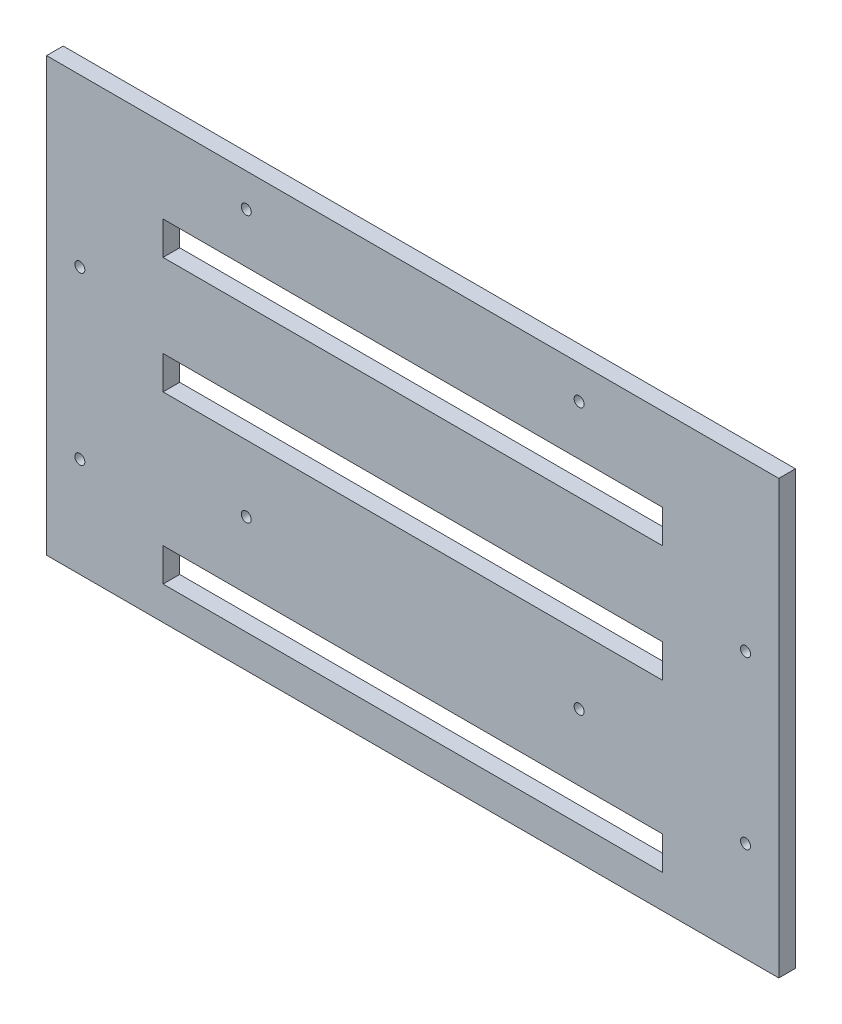
ISO-10303-21;
HEADER;
FILE_DESCRIPTION(('STEP AP214'),'2;1');
FILE_NAME('part.step','',(''),(''),'','','');
FILE_SCHEMA(('AUTOMOTIVE_DESIGN { 1 0 10303 214 1 1 1 1 }'));
ENDSEC;
DATA;
#1=APPLICATION_CONTEXT('core data for automotive mechanical design processes');
#2=APPLICATION_PROTOCOL_DEFINITION('international standard','automotive_design',2000,#1);
#3=PRODUCT_CONTEXT('',#1,'mechanical');
#4=PRODUCT('Part','Part','',(#3));
#5=PRODUCT_RELATED_PRODUCT_CATEGORY('part','',(#4));
#6=PRODUCT_DEFINITION_FORMATION('','',#4);
#7=PRODUCT_DEFINITION_CONTEXT('part definition',#1,'design');
#8=PRODUCT_DEFINITION('design','',#6,#7);
#9=PRODUCT_DEFINITION_SHAPE('','',#8);
#10=(LENGTH_UNIT() NAMED_UNIT(*) SI_UNIT(.MILLI.,.METRE.));
#11=(NAMED_UNIT(*) PLANE_ANGLE_UNIT() SI_UNIT($,.RADIAN.));
#12=(NAMED_UNIT(*) SI_UNIT($,.STERADIAN.) SOLID_ANGLE_UNIT());
#13=UNCERTAINTY_MEASURE_WITH_UNIT(LENGTH_MEASURE(1.E-05),#10,'distance_accuracy_value','');
#14=(GEOMETRIC_REPRESENTATION_CONTEXT(3) GLOBAL_UNCERTAINTY_ASSIGNED_CONTEXT((#13)) GLOBAL_UNIT_ASSIGNED_CONTEXT((#10,
#11,#12)) REPRESENTATION_CONTEXT('',''));
#15=CARTESIAN_POINT('',(0.,0.,0.));
#16=DIRECTION('',(0.,0.,1.));
#17=DIRECTION('',(1.,0.,0.));
#18=AXIS2_PLACEMENT_3D('',#15,#16,#17);
#19=CARTESIAN_POINT('',(110.,65.,5.));
#20=DIRECTION('',(-1.,0.,0.));
#21=DIRECTION('',(0.,-1.,0.));
#22=AXIS2_PLACEMENT_3D('',#19,#20,#21);
#23=PLANE('',#22);
#24=DIRECTION('',(0.,1.,0.));
#25=VECTOR('',#24,1.);
#26=CARTESIAN_POINT('',(110.,65.,0.));
#27=LINE('',#26,#25);
#28=CARTESIAN_POINT('',(110.,-65.,0.));
#29=VERTEX_POINT('',#28);
#30=CARTESIAN_POINT('',(110.,65.,0.));
#31=VERTEX_POINT('',#30);
#32=EDGE_CURVE('E264',#29,#31,#27,.T.);
#33=ORIENTED_EDGE('',*,*,#32,.T.);
#34=DIRECTION('',(0.,0.,-1.));
#35=VECTOR('',#34,1.);
#36=CARTESIAN_POINT('',(110.,65.,5.));
#37=LINE('',#36,#35);
#38=CARTESIAN_POINT('',(110.,65.,5.));
#39=VERTEX_POINT('',#38);
#40=EDGE_CURVE('E293',#39,#31,#37,.T.);
#41=ORIENTED_EDGE('',*,*,#40,.F.);
#42=DIRECTION('',(0.,1.,0.));
#43=VECTOR('',#42,1.);
#44=CARTESIAN_POINT('',(110.,65.,5.));
#45=LINE('',#44,#43);
#46=CARTESIAN_POINT('',(110.,-65.,5.));
#47=VERTEX_POINT('',#46);
#48=EDGE_CURVE('E267',#47,#39,#45,.T.);
#49=ORIENTED_EDGE('',*,*,#48,.F.);
#50=DIRECTION('',(0.,0.,-1.));
#51=VECTOR('',#50,1.);
#52=CARTESIAN_POINT('',(110.,-65.,5.));
#53=LINE('',#52,#51);
#54=EDGE_CURVE('E277',#47,#29,#53,.T.);
#55=ORIENTED_EDGE('',*,*,#54,.T.);
#56=EDGE_LOOP('',(#33,#41,#49,#55));
#57=FACE_BOUND('',#56,.T.);
#58=ADVANCED_FACE('F35',(#57),#23,.F.);
#59=CARTESIAN_POINT('',(-110.,65.,5.));
#60=DIRECTION('',(0.,-1.,0.));
#61=DIRECTION('',(0.,0.,-1.));
#62=AXIS2_PLACEMENT_3D('',#59,#60,#61);
#63=PLANE('',#62);
#64=DIRECTION('',(-1.,0.,0.));
#65=VECTOR('',#64,1.);
#66=CARTESIAN_POINT('',(-110.,65.,0.));
#67=LINE('',#66,#65);
#68=CARTESIAN_POINT('',(-110.,65.,0.));
#69=VERTEX_POINT('',#68);
#70=EDGE_CURVE('E280',#31,#69,#67,.T.);
#71=ORIENTED_EDGE('',*,*,#70,.T.);
#72=DIRECTION('',(0.,0.,-1.));
#73=VECTOR('',#72,1.);
#74=CARTESIAN_POINT('',(-110.,65.,5.));
#75=LINE('',#74,#73);
#76=CARTESIAN_POINT('',(-110.,65.,5.));
#77=VERTEX_POINT('',#76);
#78=EDGE_CURVE('E290',#77,#69,#75,.T.);
#79=ORIENTED_EDGE('',*,*,#78,.F.);
#80=DIRECTION('',(-1.,0.,0.));
#81=VECTOR('',#80,1.);
#82=CARTESIAN_POINT('',(-110.,65.,5.));
#83=LINE('',#82,#81);
#84=EDGE_CURVE('E270',#39,#77,#83,.T.);
#85=ORIENTED_EDGE('',*,*,#84,.F.);
#86=ORIENTED_EDGE('',*,*,#40,.T.);
#87=EDGE_LOOP('',(#71,#79,#85,#86));
#88=FACE_BOUND('',#87,.T.);
#89=ADVANCED_FACE('F344',(#88),#63,.F.);
#90=CARTESIAN_POINT('',(-110.,65.,5.));
#91=DIRECTION('',(1.,0.,0.));
#92=DIRECTION('',(0.,1.,0.));
#93=AXIS2_PLACEMENT_3D('',#90,#91,#92);
#94=PLANE('',#93);
#95=DIRECTION('',(0.,-1.,0.));
#96=VECTOR('',#95,1.);
#97=CARTESIAN_POINT('',(-110.,65.,0.));
#98=LINE('',#97,#96);
#99=CARTESIAN_POINT('',(-110.,-65.,0.));
#100=VERTEX_POINT('',#99);
#101=EDGE_CURVE('E282',#69,#100,#98,.T.);
#102=ORIENTED_EDGE('',*,*,#101,.T.);
#103=DIRECTION('',(0.,0.,-1.));
#104=VECTOR('',#103,1.);
#105=CARTESIAN_POINT('',(-110.,-65.,5.));
#106=LINE('',#105,#104);
#107=CARTESIAN_POINT('',(-110.,-65.,5.));
#108=VERTEX_POINT('',#107);
#109=EDGE_CURVE('E287',#108,#100,#106,.T.);
#110=ORIENTED_EDGE('',*,*,#109,.F.);
#111=DIRECTION('',(0.,-1.,0.));
#112=VECTOR('',#111,1.);
#113=CARTESIAN_POINT('',(-110.,65.,5.));
#114=LINE('',#113,#112);
#115=EDGE_CURVE('E273',#77,#108,#114,.T.);
#116=ORIENTED_EDGE('',*,*,#115,.F.);
#117=ORIENTED_EDGE('',*,*,#78,.T.);
#118=EDGE_LOOP('',(#102,#110,#116,#117));
#119=FACE_BOUND('',#118,.T.);
#120=ADVANCED_FACE('F349',(#119),#94,.F.);
#121=CARTESIAN_POINT('',(-110.,-65.,5.));
#122=DIRECTION('',(0.,1.,0.));
#123=DIRECTION('',(0.,0.,1.));
#124=AXIS2_PLACEMENT_3D('',#121,#122,#123);
#125=PLANE('',#124);
#126=DIRECTION('',(1.,0.,0.));
#127=VECTOR('',#126,1.);
#128=CARTESIAN_POINT('',(-110.,-65.,0.));
#129=LINE('',#128,#127);
#130=EDGE_CURVE('E271',#100,#29,#129,.T.);
#131=ORIENTED_EDGE('',*,*,#130,.T.);
#132=ORIENTED_EDGE('',*,*,#54,.F.);
#133=DIRECTION('',(1.,0.,0.));
#134=VECTOR('',#133,1.);
#135=CARTESIAN_POINT('',(-110.,-65.,5.));
#136=LINE('',#135,#134);
#137=EDGE_CURVE('E275',#108,#47,#136,.T.);
#138=ORIENTED_EDGE('',*,*,#137,.F.);
#139=ORIENTED_EDGE('',*,*,#109,.T.);
#140=EDGE_LOOP('',(#131,#132,#138,#139));
#141=FACE_BOUND('',#140,.T.);
#142=ADVANCED_FACE('F364',(#141),#125,.F.);
#143=CARTESIAN_POINT('',(0.,0.,5.));
#144=DIRECTION('',(0.,0.,1.));
#145=DIRECTION('',(1.,0.,0.));
#146=AXIS2_PLACEMENT_3D('',#143,#144,#145);
#147=PLANE('',#146);
#148=DIRECTION('',(0.,1.,0.));
#149=VECTOR('',#148,1.);
#150=CARTESIAN_POINT('',(75.,-45.,5.));
#151=LINE('',#150,#149);
#152=CARTESIAN_POINT('',(75.,-55.,5.));
#153=VERTEX_POINT('',#152);
#154=CARTESIAN_POINT('',(75.,-45.,5.));
#155=VERTEX_POINT('',#154);
#156=EDGE_CURVE('E49',#153,#155,#151,.T.);
#157=ORIENTED_EDGE('',*,*,#156,.F.);
#158=DIRECTION('',(1.,0.,0.));
#159=VECTOR('',#158,1.);
#160=CARTESIAN_POINT('',(-75.,-55.,5.));
#161=LINE('',#160,#159);
#162=CARTESIAN_POINT('',(-75.,-55.,5.));
#163=VERTEX_POINT('',#162);
#164=EDGE_CURVE('E171',#163,#153,#161,.T.);
#165=ORIENTED_EDGE('',*,*,#164,.F.);
#166=DIRECTION('',(0.,-1.,0.));
#167=VECTOR('',#166,1.);
#168=CARTESIAN_POINT('',(-75.,-45.,5.));
#169=LINE('',#168,#167);
#170=CARTESIAN_POINT('',(-75.,-45.,5.));
#171=VERTEX_POINT('',#170);
#172=EDGE_CURVE('E154',#171,#163,#169,.T.);
#173=ORIENTED_EDGE('',*,*,#172,.F.);
#174=DIRECTION('',(-1.,0.,0.));
#175=VECTOR('',#174,1.);
#176=CARTESIAN_POINT('',(-75.,-45.,5.));
#177=LINE('',#176,#175);
#178=EDGE_CURVE('E164',#155,#171,#177,.T.);
#179=ORIENTED_EDGE('',*,*,#178,.F.);
#180=EDGE_LOOP('',(#157,#165,#173,#179));
#181=FACE_BOUND('',#180,.T.);
#182=DIRECTION('',(0.,1.,0.));
#183=VECTOR('',#182,1.);
#184=CARTESIAN_POINT('',(75.0000000000001,40.,5.));
#185=LINE('',#184,#183);
#186=CARTESIAN_POINT('',(75.0000000000001,30.,5.));
#187=VERTEX_POINT('',#186);
#188=CARTESIAN_POINT('',(75.0000000000001,40.,5.));
#189=VERTEX_POINT('',#188);
#190=EDGE_CURVE('E57',#187,#189,#185,.T.);
#191=ORIENTED_EDGE('',*,*,#190,.F.);
#192=DIRECTION('',(1.,0.,0.));
#193=VECTOR('',#192,1.);
#194=CARTESIAN_POINT('',(-74.9999999999999,30.,5.));
#195=LINE('',#194,#193);
#196=CARTESIAN_POINT('',(-74.9999999999999,30.,5.));
#197=VERTEX_POINT('',#196);
#198=EDGE_CURVE('E188',#197,#187,#195,.T.);
#199=ORIENTED_EDGE('',*,*,#198,.F.);
#200=DIRECTION('',(0.,-1.,0.));
#201=VECTOR('',#200,1.);
#202=CARTESIAN_POINT('',(-74.9999999999999,40.,5.));
#203=LINE('',#202,#201);
#204=CARTESIAN_POINT('',(-74.9999999999999,40.,5.));
#205=VERTEX_POINT('',#204);
#206=EDGE_CURVE('E185',#205,#197,#203,.T.);
#207=ORIENTED_EDGE('',*,*,#206,.F.);
#208=DIRECTION('',(-1.,0.,0.));
#209=VECTOR('',#208,1.);
#210=CARTESIAN_POINT('',(-74.9999999999999,40.,5.));
#211=LINE('',#210,#209);
#212=EDGE_CURVE('E182',#189,#205,#211,.T.);
#213=ORIENTED_EDGE('',*,*,#212,.F.);
#214=EDGE_LOOP('',(#191,#199,#207,#213));
#215=FACE_BOUND('',#214,.T.);
#216=DIRECTION('',(0.,1.,0.));
#217=VECTOR('',#216,1.);
#218=CARTESIAN_POINT('',(75.,5.,5.));
#219=LINE('',#218,#217);
#220=CARTESIAN_POINT('',(75.,-5.,5.));
#221=VERTEX_POINT('',#220);
#222=CARTESIAN_POINT('',(75.,5.,5.));
#223=VERTEX_POINT('',#222);
#224=EDGE_CURVE('E178',#221,#223,#219,.T.);
#225=ORIENTED_EDGE('',*,*,#224,.F.);
#226=DIRECTION('',(1.,0.,0.));
#227=VECTOR('',#226,1.);
#228=CARTESIAN_POINT('',(-75.,-5.,5.));
#229=LINE('',#228,#227);
#230=CARTESIAN_POINT('',(-75.,-5.,5.));
#231=VERTEX_POINT('',#230);
#232=EDGE_CURVE('E206',#231,#221,#229,.T.);
#233=ORIENTED_EDGE('',*,*,#232,.F.);
#234=DIRECTION('',(0.,-1.,0.));
#235=VECTOR('',#234,1.);
#236=CARTESIAN_POINT('',(-75.,5.,5.));
#237=LINE('',#236,#235);
#238=CARTESIAN_POINT('',(-75.,5.,5.));
#239=VERTEX_POINT('',#238);
#240=EDGE_CURVE('E203',#239,#231,#237,.T.);
#241=ORIENTED_EDGE('',*,*,#240,.F.);
#242=DIRECTION('',(-1.,0.,0.));
#243=VECTOR('',#242,1.);
#244=CARTESIAN_POINT('',(-75.,5.,5.));
#245=LINE('',#244,#243);
#246=EDGE_CURVE('E200',#223,#239,#245,.T.);
#247=ORIENTED_EDGE('',*,*,#246,.F.);
#248=EDGE_LOOP('',(#225,#233,#241,#247));
#249=FACE_BOUND('',#248,.T.);
#250=CARTESIAN_POINT('',(100.,-35.,5.));
#251=DIRECTION('',(0.,0.,1.));
#252=DIRECTION('',(1.,0.,0.));
#253=AXIS2_PLACEMENT_3D('',#250,#251,#252);
#254=CIRCLE('',#253,1.5);
#255=CARTESIAN_POINT('',(101.5,-35.,5.));
#256=VERTEX_POINT('',#255);
#257=EDGE_CURVE('E223',#256,#256,#254,.T.);
#258=ORIENTED_EDGE('',*,*,#257,.F.);
#259=EDGE_LOOP('',(#258));
#260=FACE_BOUND('',#259,.T.);
#261=CARTESIAN_POINT('',(-100.,15.,5.));
#262=DIRECTION('',(0.,0.,1.));
#263=DIRECTION('',(1.,0.,0.));
#264=AXIS2_PLACEMENT_3D('',#261,#262,#263);
#265=CIRCLE('',#264,1.5);
#266=CARTESIAN_POINT('',(-98.5,15.,5.));
#267=VERTEX_POINT('',#266);
#268=EDGE_CURVE('E229',#267,#267,#265,.T.);
#269=ORIENTED_EDGE('',*,*,#268,.F.);
#270=EDGE_LOOP('',(#269));
#271=FACE_BOUND('',#270,.T.);
#272=CARTESIAN_POINT('',(-100.,-35.,5.));
#273=DIRECTION('',(0.,0.,1.));
#274=DIRECTION('',(1.,0.,0.));
#275=AXIS2_PLACEMENT_3D('',#272,#273,#274);
#276=CIRCLE('',#275,1.5);
#277=CARTESIAN_POINT('',(-98.5,-35.,5.));
#278=VERTEX_POINT('',#277);
#279=EDGE_CURVE('E212',#278,#278,#276,.T.);
#280=ORIENTED_EDGE('',*,*,#279,.F.);
#281=EDGE_LOOP('',(#280));
#282=FACE_BOUND('',#281,.T.);
#283=CARTESIAN_POINT('',(100.,15.,5.));
#284=DIRECTION('',(0.,0.,1.));
#285=DIRECTION('',(1.,0.,0.));
#286=AXIS2_PLACEMENT_3D('',#283,#284,#285);
#287=CIRCLE('',#286,1.5);
#288=CARTESIAN_POINT('',(101.5,15.,5.));
#289=VERTEX_POINT('',#288);
#290=EDGE_CURVE('E222',#289,#289,#287,.T.);
#291=ORIENTED_EDGE('',*,*,#290,.F.);
#292=EDGE_LOOP('',(#291));
#293=FACE_BOUND('',#292,.T.);
#294=CARTESIAN_POINT('',(50.,55.,5.));
#295=DIRECTION('',(0.,0.,1.));
#296=DIRECTION('',(1.,0.,0.));
#297=AXIS2_PLACEMENT_3D('',#294,#295,#296);
#298=CIRCLE('',#297,1.5);
#299=CARTESIAN_POINT('',(51.5,55.,5.));
#300=VERTEX_POINT('',#299);
#301=EDGE_CURVE('E247',#300,#300,#298,.T.);
#302=ORIENTED_EDGE('',*,*,#301,.F.);
#303=EDGE_LOOP('',(#302));
#304=FACE_BOUND('',#303,.T.);
#305=CARTESIAN_POINT('',(50.,-25.,5.));
#306=DIRECTION('',(0.,0.,1.));
#307=DIRECTION('',(1.,0.,0.));
#308=AXIS2_PLACEMENT_3D('',#305,#306,#307);
#309=CIRCLE('',#308,1.5);
#310=CARTESIAN_POINT('',(51.5,-25.,5.));
#311=VERTEX_POINT('',#310);
#312=EDGE_CURVE('E253',#311,#311,#309,.T.);
#313=ORIENTED_EDGE('',*,*,#312,.F.);
#314=EDGE_LOOP('',(#313));
#315=FACE_BOUND('',#314,.T.);
#316=CARTESIAN_POINT('',(-50.,-25.,5.));
#317=DIRECTION('',(0.,0.,1.));
#318=DIRECTION('',(1.,0.,0.));
#319=AXIS2_PLACEMENT_3D('',#316,#317,#318);
#320=CIRCLE('',#319,1.5);
#321=CARTESIAN_POINT('',(-48.5,-25.,5.));
#322=VERTEX_POINT('',#321);
#323=EDGE_CURVE('E240',#322,#322,#320,.T.);
#324=ORIENTED_EDGE('',*,*,#323,.F.);
#325=EDGE_LOOP('',(#324));
#326=FACE_BOUND('',#325,.T.);
#327=CARTESIAN_POINT('',(-50.,55.,5.));
#328=DIRECTION('',(0.,0.,1.));
#329=DIRECTION('',(1.,0.,0.));
#330=AXIS2_PLACEMENT_3D('',#327,#328,#329);
#331=CIRCLE('',#330,1.5);
#332=CARTESIAN_POINT('',(-48.5,55.,5.));
#333=VERTEX_POINT('',#332);
#334=EDGE_CURVE('E246',#333,#333,#331,.T.);
#335=ORIENTED_EDGE('',*,*,#334,.F.);
#336=EDGE_LOOP('',(#335));
#337=FACE_BOUND('',#336,.T.);
#338=ORIENTED_EDGE('',*,*,#48,.T.);
#339=ORIENTED_EDGE('',*,*,#84,.T.);
#340=ORIENTED_EDGE('',*,*,#115,.T.);
#341=ORIENTED_EDGE('',*,*,#137,.T.);
#342=EDGE_LOOP('',(#338,#339,#340,#341));
#343=FACE_BOUND('',#342,.T.);
#344=ADVANCED_FACE('F168',(#181,#215,#249,#260,#271,#282,#293,#304,#315,#326,#337,#343),#147,.T.);
#345=CARTESIAN_POINT('',(0.,0.,0.));
#346=DIRECTION('',(0.,0.,1.));
#347=DIRECTION('',(1.,0.,0.));
#348=AXIS2_PLACEMENT_3D('',#345,#346,#347);
#349=PLANE('',#348);
#350=DIRECTION('',(1.,0.,0.));
#351=VECTOR('',#350,1.);
#352=CARTESIAN_POINT('',(0.,-55.,0.));
#353=LINE('',#352,#351);
#354=CARTESIAN_POINT('',(-75.,-55.,0.));
#355=VERTEX_POINT('',#354);
#356=CARTESIAN_POINT('',(75.,-55.,0.));
#357=VERTEX_POINT('',#356);
#358=EDGE_CURVE('E42',#355,#357,#353,.T.);
#359=ORIENTED_EDGE('',*,*,#358,.T.);
#360=DIRECTION('',(0.,1.,0.));
#361=VECTOR('',#360,1.);
#362=CARTESIAN_POINT('',(75.,0.,0.));
#363=LINE('',#362,#361);
#364=CARTESIAN_POINT('',(75.,-45.,0.));
#365=VERTEX_POINT('',#364);
#366=EDGE_CURVE('E11',#357,#365,#363,.T.);
#367=ORIENTED_EDGE('',*,*,#366,.T.);
#368=DIRECTION('',(-1.,0.,0.));
#369=VECTOR('',#368,1.);
#370=CARTESIAN_POINT('',(0.,-45.,0.));
#371=LINE('',#370,#369);
#372=CARTESIAN_POINT('',(-75.,-45.,0.));
#373=VERTEX_POINT('',#372);
#374=EDGE_CURVE('E320',#365,#373,#371,.T.);
#375=ORIENTED_EDGE('',*,*,#374,.T.);
#376=DIRECTION('',(0.,-1.,0.));
#377=VECTOR('',#376,1.);
#378=CARTESIAN_POINT('',(-75.0000000000001,-1.04083408558609E-13,0.));
#379=LINE('',#378,#377);
#380=EDGE_CURVE('E157',#373,#355,#379,.T.);
#381=ORIENTED_EDGE('',*,*,#380,.T.);
#382=EDGE_LOOP('',(#359,#367,#375,#381));
#383=FACE_BOUND('',#382,.T.);
#384=DIRECTION('',(1.,0.,0.));
#385=VECTOR('',#384,1.);
#386=CARTESIAN_POINT('',(0.,30.,0.));
#387=LINE('',#386,#385);
#388=CARTESIAN_POINT('',(-74.9999999999999,30.,0.));
#389=VERTEX_POINT('',#388);
#390=CARTESIAN_POINT('',(75.0000000000001,30.,0.));
#391=VERTEX_POINT('',#390);
#392=EDGE_CURVE('E314',#389,#391,#387,.T.);
#393=ORIENTED_EDGE('',*,*,#392,.T.);
#394=DIRECTION('',(0.,1.,0.));
#395=VECTOR('',#394,1.);
#396=CARTESIAN_POINT('',(75.0000000000001,0.,0.));
#397=LINE('',#396,#395);
#398=CARTESIAN_POINT('',(75.0000000000001,40.,0.));
#399=VERTEX_POINT('',#398);
#400=EDGE_CURVE('E317',#391,#399,#397,.T.);
#401=ORIENTED_EDGE('',*,*,#400,.T.);
#402=DIRECTION('',(-1.,0.,0.));
#403=VECTOR('',#402,1.);
#404=CARTESIAN_POINT('',(0.,40.,0.));
#405=LINE('',#404,#403);
#406=CARTESIAN_POINT('',(-74.9999999999999,40.,0.));
#407=VERTEX_POINT('',#406);
#408=EDGE_CURVE('E308',#399,#407,#405,.T.);
#409=ORIENTED_EDGE('',*,*,#408,.T.);
#410=DIRECTION('',(0.,-1.,0.));
#411=VECTOR('',#410,1.);
#412=CARTESIAN_POINT('',(-74.9999999999999,0.,0.));
#413=LINE('',#412,#411);
#414=EDGE_CURVE('E311',#407,#389,#413,.T.);
#415=ORIENTED_EDGE('',*,*,#414,.T.);
#416=EDGE_LOOP('',(#393,#401,#409,#415));
#417=FACE_BOUND('',#416,.T.);
#418=DIRECTION('',(1.,0.,0.));
#419=VECTOR('',#418,1.);
#420=CARTESIAN_POINT('',(0.,-5.,0.));
#421=LINE('',#420,#419);
#422=CARTESIAN_POINT('',(-75.,-5.,0.));
#423=VERTEX_POINT('',#422);
#424=CARTESIAN_POINT('',(75.,-5.,0.));
#425=VERTEX_POINT('',#424);
#426=EDGE_CURVE('E302',#423,#425,#421,.T.);
#427=ORIENTED_EDGE('',*,*,#426,.T.);
#428=DIRECTION('',(0.,1.,0.));
#429=VECTOR('',#428,1.);
#430=CARTESIAN_POINT('',(75.,0.,0.));
#431=LINE('',#430,#429);
#432=CARTESIAN_POINT('',(75.,5.,0.));
#433=VERTEX_POINT('',#432);
#434=EDGE_CURVE('E305',#425,#433,#431,.T.);
#435=ORIENTED_EDGE('',*,*,#434,.T.);
#436=DIRECTION('',(-1.,0.,0.));
#437=VECTOR('',#436,1.);
#438=CARTESIAN_POINT('',(0.,5.,0.));
#439=LINE('',#438,#437);
#440=CARTESIAN_POINT('',(-75.,5.,0.));
#441=VERTEX_POINT('',#440);
#442=EDGE_CURVE('E296',#433,#441,#439,.T.);
#443=ORIENTED_EDGE('',*,*,#442,.T.);
#444=DIRECTION('',(0.,-1.,0.));
#445=VECTOR('',#444,1.);
#446=CARTESIAN_POINT('',(-75.,0.,0.));
#447=LINE('',#446,#445);
#448=EDGE_CURVE('E299',#441,#423,#447,.T.);
#449=ORIENTED_EDGE('',*,*,#448,.T.);
#450=EDGE_LOOP('',(#427,#435,#443,#449));
#451=FACE_BOUND('',#450,.T.);
#452=CARTESIAN_POINT('',(100.,-35.,0.));
#453=DIRECTION('',(0.,0.,1.));
#454=DIRECTION('',(1.,0.,0.));
#455=AXIS2_PLACEMENT_3D('',#452,#453,#454);
#456=CIRCLE('',#455,1.5);
#457=CARTESIAN_POINT('',(101.5,-35.,0.));
#458=VERTEX_POINT('',#457);
#459=EDGE_CURVE('E219',#458,#458,#456,.T.);
#460=ORIENTED_EDGE('',*,*,#459,.T.);
#461=EDGE_LOOP('',(#460));
#462=FACE_BOUND('',#461,.T.);
#463=CARTESIAN_POINT('',(-100.,15.,0.));
#464=DIRECTION('',(0.,0.,1.));
#465=DIRECTION('',(1.,0.,0.));
#466=AXIS2_PLACEMENT_3D('',#463,#464,#465);
#467=CIRCLE('',#466,1.5);
#468=CARTESIAN_POINT('',(-98.5,15.,0.));
#469=VERTEX_POINT('',#468);
#470=EDGE_CURVE('E226',#469,#469,#467,.T.);
#471=ORIENTED_EDGE('',*,*,#470,.T.);
#472=EDGE_LOOP('',(#471));
#473=FACE_BOUND('',#472,.T.);
#474=CARTESIAN_POINT('',(-100.,-35.,0.));
#475=DIRECTION('',(0.,0.,1.));
#476=DIRECTION('',(1.,0.,0.));
#477=AXIS2_PLACEMENT_3D('',#474,#475,#476);
#478=CIRCLE('',#477,1.5);
#479=CARTESIAN_POINT('',(-98.5,-35.,0.));
#480=VERTEX_POINT('',#479);
#481=EDGE_CURVE('E232',#480,#480,#478,.T.);
#482=ORIENTED_EDGE('',*,*,#481,.T.);
#483=EDGE_LOOP('',(#482));
#484=FACE_BOUND('',#483,.T.);
#485=CARTESIAN_POINT('',(100.,15.,0.));
#486=DIRECTION('',(0.,0.,1.));
#487=DIRECTION('',(1.,0.,0.));
#488=AXIS2_PLACEMENT_3D('',#485,#486,#487);
#489=CIRCLE('',#488,1.5);
#490=CARTESIAN_POINT('',(101.5,15.,0.));
#491=VERTEX_POINT('',#490);
#492=EDGE_CURVE('E237',#491,#491,#489,.T.);
#493=ORIENTED_EDGE('',*,*,#492,.T.);
#494=EDGE_LOOP('',(#493));
#495=FACE_BOUND('',#494,.T.);
#496=CARTESIAN_POINT('',(50.,55.,0.));
#497=DIRECTION('',(0.,0.,1.));
#498=DIRECTION('',(1.,0.,0.));
#499=AXIS2_PLACEMENT_3D('',#496,#497,#498);
#500=CIRCLE('',#499,1.5);
#501=CARTESIAN_POINT('',(51.5,55.,0.));
#502=VERTEX_POINT('',#501);
#503=EDGE_CURVE('E243',#502,#502,#500,.T.);
#504=ORIENTED_EDGE('',*,*,#503,.T.);
#505=EDGE_LOOP('',(#504));
#506=FACE_BOUND('',#505,.T.);
#507=CARTESIAN_POINT('',(50.,-25.,0.));
#508=DIRECTION('',(0.,0.,1.));
#509=DIRECTION('',(1.,0.,0.));
#510=AXIS2_PLACEMENT_3D('',#507,#508,#509);
#511=CIRCLE('',#510,1.5);
#512=CARTESIAN_POINT('',(51.5,-25.,0.));
#513=VERTEX_POINT('',#512);
#514=EDGE_CURVE('E250',#513,#513,#511,.T.);
#515=ORIENTED_EDGE('',*,*,#514,.T.);
#516=EDGE_LOOP('',(#515));
#517=FACE_BOUND('',#516,.T.);
#518=CARTESIAN_POINT('',(-50.,-25.,0.));
#519=DIRECTION('',(0.,0.,1.));
#520=DIRECTION('',(1.,0.,0.));
#521=AXIS2_PLACEMENT_3D('',#518,#519,#520);
#522=CIRCLE('',#521,1.5);
#523=CARTESIAN_POINT('',(-48.5,-25.,0.));
#524=VERTEX_POINT('',#523);
#525=EDGE_CURVE('E256',#524,#524,#522,.T.);
#526=ORIENTED_EDGE('',*,*,#525,.T.);
#527=EDGE_LOOP('',(#526));
#528=FACE_BOUND('',#527,.T.);
#529=CARTESIAN_POINT('',(-50.,55.,0.));
#530=DIRECTION('',(0.,0.,1.));
#531=DIRECTION('',(1.,0.,0.));
#532=AXIS2_PLACEMENT_3D('',#529,#530,#531);
#533=CIRCLE('',#532,1.5);
#534=CARTESIAN_POINT('',(-48.5,55.,0.));
#535=VERTEX_POINT('',#534);
#536=EDGE_CURVE('E261',#535,#535,#533,.T.);
#537=ORIENTED_EDGE('',*,*,#536,.T.);
#538=EDGE_LOOP('',(#537));
#539=FACE_BOUND('',#538,.T.);
#540=ORIENTED_EDGE('',*,*,#32,.F.);
#541=ORIENTED_EDGE('',*,*,#130,.F.);
#542=ORIENTED_EDGE('',*,*,#101,.F.);
#543=ORIENTED_EDGE('',*,*,#70,.F.);
#544=EDGE_LOOP('',(#540,#541,#542,#543));
#545=FACE_BOUND('',#544,.T.);
#546=ADVANCED_FACE('F324',(#383,#417,#451,#462,#473,#484,#495,#506,#517,#528,#539,#545),#349,.F.);
#547=CARTESIAN_POINT('',(-50.,55.,0.));
#548=DIRECTION('',(0.,0.,1.));
#549=DIRECTION('',(1.,0.,0.));
#550=AXIS2_PLACEMENT_3D('',#547,#548,#549);
#551=CYLINDRICAL_SURFACE('',#550,1.5);
#552=ORIENTED_EDGE('',*,*,#536,.F.);
#553=EDGE_LOOP('',(#552));
#554=FACE_BOUND('',#553,.T.);
#555=ORIENTED_EDGE('',*,*,#334,.T.);
#556=EDGE_LOOP('',(#555));
#557=FACE_BOUND('',#556,.T.);
#558=ADVANCED_FACE('F375',(#554,#557),#551,.F.);
#559=CARTESIAN_POINT('',(-50.,-25.,0.));
#560=DIRECTION('',(0.,0.,1.));
#561=DIRECTION('',(1.,0.,0.));
#562=AXIS2_PLACEMENT_3D('',#559,#560,#561);
#563=CYLINDRICAL_SURFACE('',#562,1.5);
#564=ORIENTED_EDGE('',*,*,#525,.F.);
#565=EDGE_LOOP('',(#564));
#566=FACE_BOUND('',#565,.T.);
#567=ORIENTED_EDGE('',*,*,#323,.T.);
#568=EDGE_LOOP('',(#567));
#569=FACE_BOUND('',#568,.T.);
#570=ADVANCED_FACE('F380',(#566,#569),#563,.F.);
#571=CARTESIAN_POINT('',(50.,-25.,0.));
#572=DIRECTION('',(0.,0.,1.));
#573=DIRECTION('',(1.,0.,0.));
#574=AXIS2_PLACEMENT_3D('',#571,#572,#573);
#575=CYLINDRICAL_SURFACE('',#574,1.5);
#576=ORIENTED_EDGE('',*,*,#514,.F.);
#577=EDGE_LOOP('',(#576));
#578=FACE_BOUND('',#577,.T.);
#579=ORIENTED_EDGE('',*,*,#312,.T.);
#580=EDGE_LOOP('',(#579));
#581=FACE_BOUND('',#580,.T.);
#582=ADVANCED_FACE('F384',(#578,#581),#575,.F.);
#583=CARTESIAN_POINT('',(50.,55.,0.));
#584=DIRECTION('',(0.,0.,1.));
#585=DIRECTION('',(1.,0.,0.));
#586=AXIS2_PLACEMENT_3D('',#583,#584,#585);
#587=CYLINDRICAL_SURFACE('',#586,1.5);
#588=ORIENTED_EDGE('',*,*,#503,.F.);
#589=EDGE_LOOP('',(#588));
#590=FACE_BOUND('',#589,.T.);
#591=ORIENTED_EDGE('',*,*,#301,.T.);
#592=EDGE_LOOP('',(#591));
#593=FACE_BOUND('',#592,.T.);
#594=ADVANCED_FACE('F388',(#590,#593),#587,.F.);
#595=CARTESIAN_POINT('',(100.,15.,0.));
#596=DIRECTION('',(0.,0.,1.));
#597=DIRECTION('',(1.,0.,0.));
#598=AXIS2_PLACEMENT_3D('',#595,#596,#597);
#599=CYLINDRICAL_SURFACE('',#598,1.5);
#600=ORIENTED_EDGE('',*,*,#492,.F.);
#601=EDGE_LOOP('',(#600));
#602=FACE_BOUND('',#601,.T.);
#603=ORIENTED_EDGE('',*,*,#290,.T.);
#604=EDGE_LOOP('',(#603));
#605=FACE_BOUND('',#604,.T.);
#606=ADVANCED_FACE('F392',(#602,#605),#599,.F.);
#607=CARTESIAN_POINT('',(-100.,-35.,0.));
#608=DIRECTION('',(0.,0.,1.));
#609=DIRECTION('',(1.,0.,0.));
#610=AXIS2_PLACEMENT_3D('',#607,#608,#609);
#611=CYLINDRICAL_SURFACE('',#610,1.5);
#612=ORIENTED_EDGE('',*,*,#481,.F.);
#613=EDGE_LOOP('',(#612));
#614=FACE_BOUND('',#613,.T.);
#615=ORIENTED_EDGE('',*,*,#279,.T.);
#616=EDGE_LOOP('',(#615));
#617=FACE_BOUND('',#616,.T.);
#618=ADVANCED_FACE('F396',(#614,#617),#611,.F.);
#619=CARTESIAN_POINT('',(-100.,15.,0.));
#620=DIRECTION('',(0.,0.,1.));
#621=DIRECTION('',(1.,0.,0.));
#622=AXIS2_PLACEMENT_3D('',#619,#620,#621);
#623=CYLINDRICAL_SURFACE('',#622,1.5);
#624=ORIENTED_EDGE('',*,*,#470,.F.);
#625=EDGE_LOOP('',(#624));
#626=FACE_BOUND('',#625,.T.);
#627=ORIENTED_EDGE('',*,*,#268,.T.);
#628=EDGE_LOOP('',(#627));
#629=FACE_BOUND('',#628,.T.);
#630=ADVANCED_FACE('F400',(#626,#629),#623,.F.);
#631=CARTESIAN_POINT('',(100.,-35.,0.));
#632=DIRECTION('',(0.,0.,1.));
#633=DIRECTION('',(1.,0.,0.));
#634=AXIS2_PLACEMENT_3D('',#631,#632,#633);
#635=CYLINDRICAL_SURFACE('',#634,1.5);
#636=ORIENTED_EDGE('',*,*,#459,.F.);
#637=EDGE_LOOP('',(#636));
#638=FACE_BOUND('',#637,.T.);
#639=ORIENTED_EDGE('',*,*,#257,.T.);
#640=EDGE_LOOP('',(#639));
#641=FACE_BOUND('',#640,.T.);
#642=ADVANCED_FACE('F404',(#638,#641),#635,.F.);
#643=CARTESIAN_POINT('',(75.,5.,-5.));
#644=DIRECTION('',(1.,0.,0.));
#645=DIRECTION('',(0.,0.,-1.));
#646=AXIS2_PLACEMENT_3D('',#643,#644,#645);
#647=PLANE('',#646);
#648=DIRECTION('',(0.,0.,1.));
#649=VECTOR('',#648,1.);
#650=CARTESIAN_POINT('',(75.,-5.,-5.));
#651=LINE('',#650,#649);
#652=EDGE_CURVE('E210',#425,#221,#651,.T.);
#653=ORIENTED_EDGE('',*,*,#652,.T.);
#654=ORIENTED_EDGE('',*,*,#224,.T.);
#655=DIRECTION('',(0.,0.,1.));
#656=VECTOR('',#655,1.);
#657=CARTESIAN_POINT('',(75.,5.,-5.));
#658=LINE('',#657,#656);
#659=EDGE_CURVE('E209',#433,#223,#658,.T.);
#660=ORIENTED_EDGE('',*,*,#659,.F.);
#661=ORIENTED_EDGE('',*,*,#434,.F.);
#662=EDGE_LOOP('',(#653,#654,#660,#661));
#663=FACE_BOUND('',#662,.T.);
#664=ADVANCED_FACE('F408',(#663),#647,.F.);
#665=CARTESIAN_POINT('',(-75.,-5.,-5.));
#666=DIRECTION('',(0.,-1.,0.));
#667=DIRECTION('',(0.,0.,-1.));
#668=AXIS2_PLACEMENT_3D('',#665,#666,#667);
#669=PLANE('',#668);
#670=DIRECTION('',(0.,0.,1.));
#671=VECTOR('',#670,1.);
#672=CARTESIAN_POINT('',(-75.,-5.,-5.));
#673=LINE('',#672,#671);
#674=EDGE_CURVE('E213',#423,#231,#673,.T.);
#675=ORIENTED_EDGE('',*,*,#674,.T.);
#676=ORIENTED_EDGE('',*,*,#232,.T.);
#677=ORIENTED_EDGE('',*,*,#652,.F.);
#678=ORIENTED_EDGE('',*,*,#426,.F.);
#679=EDGE_LOOP('',(#675,#676,#677,#678));
#680=FACE_BOUND('',#679,.T.);
#681=ADVANCED_FACE('F412',(#680),#669,.F.);
#682=CARTESIAN_POINT('',(-75.,5.,-5.));
#683=DIRECTION('',(-1.,0.,0.));
#684=DIRECTION('',(0.,0.,1.));
#685=AXIS2_PLACEMENT_3D('',#682,#683,#684);
#686=PLANE('',#685);
#687=DIRECTION('',(0.,0.,1.));
#688=VECTOR('',#687,1.);
#689=CARTESIAN_POINT('',(-75.,5.,-5.));
#690=LINE('',#689,#688);
#691=EDGE_CURVE('E215',#441,#239,#690,.T.);
#692=ORIENTED_EDGE('',*,*,#691,.T.);
#693=ORIENTED_EDGE('',*,*,#240,.T.);
#694=ORIENTED_EDGE('',*,*,#674,.F.);
#695=ORIENTED_EDGE('',*,*,#448,.F.);
#696=EDGE_LOOP('',(#692,#693,#694,#695));
#697=FACE_BOUND('',#696,.T.);
#698=ADVANCED_FACE('F418',(#697),#686,.F.);
#699=CARTESIAN_POINT('',(-75.,5.,-5.));
#700=DIRECTION('',(0.,1.,0.));
#701=DIRECTION('',(0.,0.,1.));
#702=AXIS2_PLACEMENT_3D('',#699,#700,#701);
#703=PLANE('',#702);
#704=ORIENTED_EDGE('',*,*,#659,.T.);
#705=ORIENTED_EDGE('',*,*,#246,.T.);
#706=ORIENTED_EDGE('',*,*,#691,.F.);
#707=ORIENTED_EDGE('',*,*,#442,.F.);
#708=EDGE_LOOP('',(#704,#705,#706,#707));
#709=FACE_BOUND('',#708,.T.);
#710=ADVANCED_FACE('F414',(#709),#703,.F.);
#711=CARTESIAN_POINT('',(75.0000000000001,40.,-5.));
#712=DIRECTION('',(1.,0.,0.));
#713=DIRECTION('',(0.,0.,-1.));
#714=AXIS2_PLACEMENT_3D('',#711,#712,#713);
#715=PLANE('',#714);
#716=DIRECTION('',(0.,0.,1.));
#717=VECTOR('',#716,1.);
#718=CARTESIAN_POINT('',(75.0000000000001,30.,-5.));
#719=LINE('',#718,#717);
#720=EDGE_CURVE('E192',#391,#187,#719,.T.);
#721=ORIENTED_EDGE('',*,*,#720,.T.);
#722=ORIENTED_EDGE('',*,*,#190,.T.);
#723=DIRECTION('',(0.,0.,1.));
#724=VECTOR('',#723,1.);
#725=CARTESIAN_POINT('',(75.0000000000001,40.,-5.));
#726=LINE('',#725,#724);
#727=EDGE_CURVE('E191',#399,#189,#726,.T.);
#728=ORIENTED_EDGE('',*,*,#727,.F.);
#729=ORIENTED_EDGE('',*,*,#400,.F.);
#730=EDGE_LOOP('',(#721,#722,#728,#729));
#731=FACE_BOUND('',#730,.T.);
#732=ADVANCED_FACE('F417',(#731),#715,.F.);
#733=CARTESIAN_POINT('',(-74.9999999999999,30.,-5.));
#734=DIRECTION('',(0.,-1.,0.));
#735=DIRECTION('',(0.,0.,-1.));
#736=AXIS2_PLACEMENT_3D('',#733,#734,#735);
#737=PLANE('',#736);
#738=DIRECTION('',(0.,0.,1.));
#739=VECTOR('',#738,1.);
#740=CARTESIAN_POINT('',(-74.9999999999999,30.,-5.));
#741=LINE('',#740,#739);
#742=EDGE_CURVE('E194',#389,#197,#741,.T.);
#743=ORIENTED_EDGE('',*,*,#742,.T.);
#744=ORIENTED_EDGE('',*,*,#198,.T.);
#745=ORIENTED_EDGE('',*,*,#720,.F.);
#746=ORIENTED_EDGE('',*,*,#392,.F.);
#747=EDGE_LOOP('',(#743,#744,#745,#746));
#748=FACE_BOUND('',#747,.T.);
#749=ADVANCED_FACE('F427',(#748),#737,.F.);
#750=CARTESIAN_POINT('',(-74.9999999999999,40.,-5.));
#751=DIRECTION('',(-1.,0.,0.));
#752=DIRECTION('',(0.,0.,1.));
#753=AXIS2_PLACEMENT_3D('',#750,#751,#752);
#754=PLANE('',#753);
#755=DIRECTION('',(0.,0.,1.));
#756=VECTOR('',#755,1.);
#757=CARTESIAN_POINT('',(-74.9999999999999,40.,-5.));
#758=LINE('',#757,#756);
#759=EDGE_CURVE('E196',#407,#205,#758,.T.);
#760=ORIENTED_EDGE('',*,*,#759,.T.);
#761=ORIENTED_EDGE('',*,*,#206,.T.);
#762=ORIENTED_EDGE('',*,*,#742,.F.);
#763=ORIENTED_EDGE('',*,*,#414,.F.);
#764=EDGE_LOOP('',(#760,#761,#762,#763));
#765=FACE_BOUND('',#764,.T.);
#766=ADVANCED_FACE('F338',(#765),#754,.F.);
#767=CARTESIAN_POINT('',(-74.9999999999999,40.,-5.));
#768=DIRECTION('',(0.,1.,0.));
#769=DIRECTION('',(0.,0.,1.));
#770=AXIS2_PLACEMENT_3D('',#767,#768,#769);
#771=PLANE('',#770);
#772=ORIENTED_EDGE('',*,*,#727,.T.);
#773=ORIENTED_EDGE('',*,*,#212,.T.);
#774=ORIENTED_EDGE('',*,*,#759,.F.);
#775=ORIENTED_EDGE('',*,*,#408,.F.);
#776=EDGE_LOOP('',(#772,#773,#774,#775));
#777=FACE_BOUND('',#776,.T.);
#778=ADVANCED_FACE('F331',(#777),#771,.F.);
#779=CARTESIAN_POINT('',(75.,-45.,-5.));
#780=DIRECTION('',(1.,0.,0.));
#781=DIRECTION('',(0.,0.,-1.));
#782=AXIS2_PLACEMENT_3D('',#779,#780,#781);
#783=PLANE('',#782);
#784=DIRECTION('',(0.,0.,1.));
#785=VECTOR('',#784,1.);
#786=CARTESIAN_POINT('',(75.,-55.,-5.));
#787=LINE('',#786,#785);
#788=EDGE_CURVE('E176',#357,#153,#787,.T.);
#789=ORIENTED_EDGE('',*,*,#788,.T.);
#790=ORIENTED_EDGE('',*,*,#156,.T.);
#791=DIRECTION('',(0.,0.,1.));
#792=VECTOR('',#791,1.);
#793=CARTESIAN_POINT('',(75.,-45.,-5.));
#794=LINE('',#793,#792);
#795=EDGE_CURVE('E161',#365,#155,#794,.T.);
#796=ORIENTED_EDGE('',*,*,#795,.F.);
#797=ORIENTED_EDGE('',*,*,#366,.F.);
#798=EDGE_LOOP('',(#789,#790,#796,#797));
#799=FACE_BOUND('',#798,.T.);
#800=ADVANCED_FACE('F329',(#799),#783,.F.);
#801=CARTESIAN_POINT('',(-75.,-55.,-5.));
#802=DIRECTION('',(0.,-1.,0.));
#803=DIRECTION('',(0.,0.,-1.));
#804=AXIS2_PLACEMENT_3D('',#801,#802,#803);
#805=PLANE('',#804);
#806=DIRECTION('',(0.,0.,1.));
#807=VECTOR('',#806,1.);
#808=CARTESIAN_POINT('',(-75.,-55.,-5.));
#809=LINE('',#808,#807);
#810=EDGE_CURVE('E160',#355,#163,#809,.T.);
#811=ORIENTED_EDGE('',*,*,#810,.T.);
#812=ORIENTED_EDGE('',*,*,#164,.T.);
#813=ORIENTED_EDGE('',*,*,#788,.F.);
#814=ORIENTED_EDGE('',*,*,#358,.F.);
#815=EDGE_LOOP('',(#811,#812,#813,#814));
#816=FACE_BOUND('',#815,.T.);
#817=ADVANCED_FACE('F328',(#816),#805,.F.);
#818=CARTESIAN_POINT('',(-75.,-45.,-5.));
#819=DIRECTION('',(-1.,0.,0.));
#820=DIRECTION('',(0.,-1.,0.));
#821=AXIS2_PLACEMENT_3D('',#818,#819,#820);
#822=PLANE('',#821);
#823=DIRECTION('',(0.,0.,1.));
#824=VECTOR('',#823,1.);
#825=CARTESIAN_POINT('',(-75.,-45.,-5.));
#826=LINE('',#825,#824);
#827=EDGE_CURVE('E149',#373,#171,#826,.T.);
#828=ORIENTED_EDGE('',*,*,#827,.T.);
#829=ORIENTED_EDGE('',*,*,#172,.T.);
#830=ORIENTED_EDGE('',*,*,#810,.F.);
#831=ORIENTED_EDGE('',*,*,#380,.F.);
#832=EDGE_LOOP('',(#828,#829,#830,#831));
#833=FACE_BOUND('',#832,.T.);
#834=ADVANCED_FACE('F151',(#833),#822,.F.);
#835=CARTESIAN_POINT('',(-75.,-45.,-5.));
#836=DIRECTION('',(0.,1.,0.));
#837=DIRECTION('',(0.,0.,1.));
#838=AXIS2_PLACEMENT_3D('',#835,#836,#837);
#839=PLANE('',#838);
#840=ORIENTED_EDGE('',*,*,#795,.T.);
#841=ORIENTED_EDGE('',*,*,#178,.T.);
#842=ORIENTED_EDGE('',*,*,#827,.F.);
#843=ORIENTED_EDGE('',*,*,#374,.F.);
#844=EDGE_LOOP('',(#840,#841,#842,#843));
#845=FACE_BOUND('',#844,.T.);
#846=ADVANCED_FACE('F165',(#845),#839,.F.);
#847=CLOSED_SHELL('',(#58,#89,#120,#142,#344,#546,#558,#570,#582,#594,#606,#618,#630,#642,#664,
#681,#698,#710,#732,#749,#766,#778,#800,#817,#834,#846));
#848=MANIFOLD_SOLID_BREP('B2',#847);
#849=ADVANCED_BREP_SHAPE_REPRESENTATION('',(#18,#848),#14);
#850=SHAPE_DEFINITION_REPRESENTATION(#9,#849);
ENDSEC;
END-ISO-10303-21;
